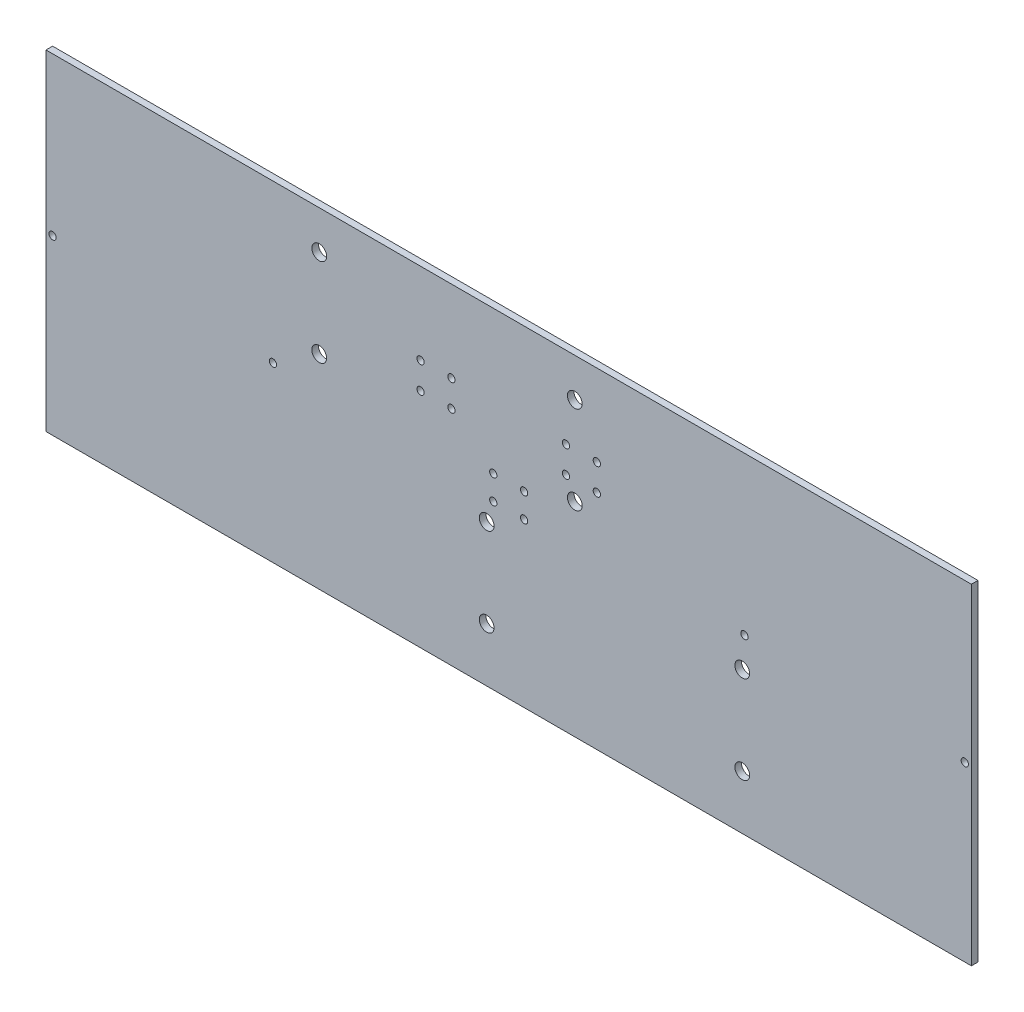
ISO-10303-21;
HEADER;
FILE_DESCRIPTION(('STEP AP214'),'2;1');
FILE_NAME('part.step','',(''),(''),'','','');
FILE_SCHEMA(('AUTOMOTIVE_DESIGN { 1 0 10303 214 1 1 1 1 }'));
ENDSEC;
DATA;
#1=APPLICATION_CONTEXT('core data for automotive mechanical design processes');
#2=APPLICATION_PROTOCOL_DEFINITION('international standard','automotive_design',2000,#1);
#3=PRODUCT_CONTEXT('',#1,'mechanical');
#4=PRODUCT('Part','Part','',(#3));
#5=PRODUCT_RELATED_PRODUCT_CATEGORY('part','',(#4));
#6=PRODUCT_DEFINITION_FORMATION('','',#4);
#7=PRODUCT_DEFINITION_CONTEXT('part definition',#1,'design');
#8=PRODUCT_DEFINITION('design','',#6,#7);
#9=PRODUCT_DEFINITION_SHAPE('','',#8);
#10=(LENGTH_UNIT() NAMED_UNIT(*) SI_UNIT(.MILLI.,.METRE.));
#11=(NAMED_UNIT(*) PLANE_ANGLE_UNIT() SI_UNIT($,.RADIAN.));
#12=(NAMED_UNIT(*) SI_UNIT($,.STERADIAN.) SOLID_ANGLE_UNIT());
#13=UNCERTAINTY_MEASURE_WITH_UNIT(LENGTH_MEASURE(1.E-05),#10,'distance_accuracy_value','');
#14=(GEOMETRIC_REPRESENTATION_CONTEXT(3) GLOBAL_UNCERTAINTY_ASSIGNED_CONTEXT((#13)) GLOBAL_UNIT_ASSIGNED_CONTEXT((#10,
#11,#12)) REPRESENTATION_CONTEXT('',''));
#15=CARTESIAN_POINT('',(0.,0.,0.));
#16=DIRECTION('',(0.,0.,1.));
#17=DIRECTION('',(1.,0.,0.));
#18=AXIS2_PLACEMENT_3D('',#15,#16,#17);
#19=CARTESIAN_POINT('',(0.,0.,3.));
#20=DIRECTION('',(1.,0.,0.));
#21=DIRECTION('',(0.,0.,-1.));
#22=AXIS2_PLACEMENT_3D('',#19,#20,#21);
#23=PLANE('',#22);
#24=DIRECTION('',(0.,0.,1.));
#25=VECTOR('',#24,1.);
#26=CARTESIAN_POINT('',(0.,150.,0.));
#27=LINE('',#26,#25);
#28=CARTESIAN_POINT('',(0.,150.,0.));
#29=VERTEX_POINT('',#28);
#30=CARTESIAN_POINT('',(0.,150.,3.));
#31=VERTEX_POINT('',#30);
#32=EDGE_CURVE('E96',#29,#31,#27,.T.);
#33=ORIENTED_EDGE('',*,*,#32,.F.);
#34=DIRECTION('',(0.,-1.,0.));
#35=VECTOR('',#34,1.);
#36=CARTESIAN_POINT('',(0.,0.,0.));
#37=LINE('',#36,#35);
#38=CARTESIAN_POINT('',(0.,0.,0.));
#39=VERTEX_POINT('',#38);
#40=EDGE_CURVE('E79',#29,#39,#37,.T.);
#41=ORIENTED_EDGE('',*,*,#40,.T.);
#42=DIRECTION('',(0.,0.,-1.));
#43=VECTOR('',#42,1.);
#44=CARTESIAN_POINT('',(0.,0.,3.));
#45=LINE('',#44,#43);
#46=CARTESIAN_POINT('',(0.,0.,3.));
#47=VERTEX_POINT('',#46);
#48=EDGE_CURVE('E11',#47,#39,#45,.T.);
#49=ORIENTED_EDGE('',*,*,#48,.F.);
#50=DIRECTION('',(0.,-1.,0.));
#51=VECTOR('',#50,1.);
#52=CARTESIAN_POINT('',(0.,0.,3.));
#53=LINE('',#52,#51);
#54=EDGE_CURVE('E87',#31,#47,#53,.T.);
#55=ORIENTED_EDGE('',*,*,#54,.F.);
#56=EDGE_LOOP('',(#33,#41,#49,#55));
#57=FACE_BOUND('',#56,.T.);
#58=ADVANCED_FACE('F35',(#57),#23,.F.);
#59=CARTESIAN_POINT('',(420.,0.,3.));
#60=DIRECTION('',(-1.,0.,0.));
#61=DIRECTION('',(0.,0.,1.));
#62=AXIS2_PLACEMENT_3D('',#59,#60,#61);
#63=PLANE('',#62);
#64=DIRECTION('',(0.,0.,-1.));
#65=VECTOR('',#64,1.);
#66=CARTESIAN_POINT('',(420.,150.,3.));
#67=LINE('',#66,#65);
#68=CARTESIAN_POINT('',(420.,150.,3.));
#69=VERTEX_POINT('',#68);
#70=CARTESIAN_POINT('',(420.,150.,0.));
#71=VERTEX_POINT('',#70);
#72=EDGE_CURVE('E49',#69,#71,#67,.T.);
#73=ORIENTED_EDGE('',*,*,#72,.F.);
#74=DIRECTION('',(0.,1.,0.));
#75=VECTOR('',#74,1.);
#76=CARTESIAN_POINT('',(420.,0.,3.));
#77=LINE('',#76,#75);
#78=CARTESIAN_POINT('',(420.,0.,3.));
#79=VERTEX_POINT('',#78);
#80=EDGE_CURVE('E84',#79,#69,#77,.T.);
#81=ORIENTED_EDGE('',*,*,#80,.F.);
#82=DIRECTION('',(0.,0.,-1.));
#83=VECTOR('',#82,1.);
#84=CARTESIAN_POINT('',(420.,0.,3.));
#85=LINE('',#84,#83);
#86=CARTESIAN_POINT('',(420.,0.,0.));
#87=VERTEX_POINT('',#86);
#88=EDGE_CURVE('E42',#79,#87,#85,.T.);
#89=ORIENTED_EDGE('',*,*,#88,.T.);
#90=DIRECTION('',(0.,1.,0.));
#91=VECTOR('',#90,1.);
#92=CARTESIAN_POINT('',(420.,0.,0.));
#93=LINE('',#92,#91);
#94=EDGE_CURVE('E78',#87,#71,#93,.T.);
#95=ORIENTED_EDGE('',*,*,#94,.T.);
#96=EDGE_LOOP('',(#73,#81,#89,#95));
#97=FACE_BOUND('',#96,.T.);
#98=ADVANCED_FACE('F83',(#97),#63,.F.);
#99=CARTESIAN_POINT('',(0.,0.,3.));
#100=DIRECTION('',(0.,0.,-1.));
#101=DIRECTION('',(-1.,0.,0.));
#102=AXIS2_PLACEMENT_3D('',#99,#100,#101);
#103=PLANE('',#102);
#104=CARTESIAN_POINT('',(417.,78.5000000000004,3.));
#105=DIRECTION('',(0.,0.,-1.));
#106=DIRECTION('',(-1.,0.,0.));
#107=AXIS2_PLACEMENT_3D('',#104,#105,#106);
#108=CIRCLE('',#107,1.64999999999999);
#109=CARTESIAN_POINT('',(415.35,78.5000000000004,3.));
#110=VERTEX_POINT('',#109);
#111=EDGE_CURVE('E101',#110,#110,#108,.T.);
#112=ORIENTED_EDGE('',*,*,#111,.T.);
#113=EDGE_LOOP('',(#112));
#114=FACE_BOUND('',#113,.T.);
#115=CARTESIAN_POINT('',(170.,113.,3.));
#116=DIRECTION('',(0.,0.,-1.));
#117=DIRECTION('',(-1.,0.,0.));
#118=AXIS2_PLACEMENT_3D('',#115,#116,#117);
#119=CIRCLE('',#118,1.64999999999999);
#120=CARTESIAN_POINT('',(168.35,113.,3.));
#121=VERTEX_POINT('',#120);
#122=EDGE_CURVE('E104',#121,#121,#119,.T.);
#123=ORIENTED_EDGE('',*,*,#122,.T.);
#124=EDGE_LOOP('',(#123));
#125=FACE_BOUND('',#124,.T.);
#126=CARTESIAN_POINT('',(170.,101.,3.));
#127=DIRECTION('',(0.,0.,-1.));
#128=DIRECTION('',(-1.,0.,0.));
#129=AXIS2_PLACEMENT_3D('',#126,#127,#128);
#130=CIRCLE('',#129,1.64999999999999);
#131=CARTESIAN_POINT('',(168.35,101.,3.));
#132=VERTEX_POINT('',#131);
#133=EDGE_CURVE('E107',#132,#132,#130,.T.);
#134=ORIENTED_EDGE('',*,*,#133,.T.);
#135=EDGE_LOOP('',(#134));
#136=FACE_BOUND('',#135,.T.);
#137=CARTESIAN_POINT('',(184.,101.,3.));
#138=DIRECTION('',(0.,0.,-1.));
#139=DIRECTION('',(-1.,0.,0.));
#140=AXIS2_PLACEMENT_3D('',#137,#138,#139);
#141=CIRCLE('',#140,1.64999999999999);
#142=CARTESIAN_POINT('',(182.35,101.,3.));
#143=VERTEX_POINT('',#142);
#144=EDGE_CURVE('E110',#143,#143,#141,.T.);
#145=ORIENTED_EDGE('',*,*,#144,.T.);
#146=EDGE_LOOP('',(#145));
#147=FACE_BOUND('',#146,.T.);
#148=CARTESIAN_POINT('',(316.,64.5,3.));
#149=DIRECTION('',(0.,0.,-1.));
#150=DIRECTION('',(-1.,0.,0.));
#151=AXIS2_PLACEMENT_3D('',#148,#149,#150);
#152=CIRCLE('',#151,3.35);
#153=CARTESIAN_POINT('',(312.65,64.5,3.));
#154=VERTEX_POINT('',#153);
#155=EDGE_CURVE('E113',#154,#154,#152,.T.);
#156=ORIENTED_EDGE('',*,*,#155,.T.);
#157=EDGE_LOOP('',(#156));
#158=FACE_BOUND('',#157,.T.);
#159=CARTESIAN_POINT('',(103.,78.5,3.));
#160=DIRECTION('',(0.,0.,-1.));
#161=DIRECTION('',(-1.,0.,0.));
#162=AXIS2_PLACEMENT_3D('',#159,#160,#161);
#163=CIRCLE('',#162,1.65);
#164=CARTESIAN_POINT('',(101.35,78.5,3.));
#165=VERTEX_POINT('',#164);
#166=EDGE_CURVE('E116',#165,#165,#163,.T.);
#167=ORIENTED_EDGE('',*,*,#166,.T.);
#168=EDGE_LOOP('',(#167));
#169=FACE_BOUND('',#168,.T.);
#170=CARTESIAN_POINT('',(2.99999999999998,78.5000000000003,3.));
#171=DIRECTION('',(0.,0.,-1.));
#172=DIRECTION('',(-1.,0.,0.));
#173=AXIS2_PLACEMENT_3D('',#170,#171,#172);
#174=CIRCLE('',#173,1.65);
#175=CARTESIAN_POINT('',(1.34999999999998,78.5000000000003,3.));
#176=VERTEX_POINT('',#175);
#177=EDGE_CURVE('E119',#176,#176,#174,.T.);
#178=ORIENTED_EDGE('',*,*,#177,.T.);
#179=EDGE_LOOP('',(#178));
#180=FACE_BOUND('',#179,.T.);
#181=CARTESIAN_POINT('',(317.,78.5,3.));
#182=DIRECTION('',(0.,0.,-1.));
#183=DIRECTION('',(-1.,0.,0.));
#184=AXIS2_PLACEMENT_3D('',#181,#182,#183);
#185=CIRCLE('',#184,1.64999999999999);
#186=CARTESIAN_POINT('',(315.35,78.5,3.));
#187=VERTEX_POINT('',#186);
#188=EDGE_CURVE('E122',#187,#187,#185,.T.);
#189=ORIENTED_EDGE('',*,*,#188,.T.);
#190=EDGE_LOOP('',(#189));
#191=FACE_BOUND('',#190,.T.);
#192=CARTESIAN_POINT('',(217.,85.,3.));
#193=DIRECTION('',(0.,0.,-1.));
#194=DIRECTION('',(-1.,0.,0.));
#195=AXIS2_PLACEMENT_3D('',#192,#193,#194);
#196=CIRCLE('',#195,1.65000000000002);
#197=CARTESIAN_POINT('',(215.35,85.,3.));
#198=VERTEX_POINT('',#197);
#199=EDGE_CURVE('E125',#198,#198,#196,.T.);
#200=ORIENTED_EDGE('',*,*,#199,.T.);
#201=EDGE_LOOP('',(#200));
#202=FACE_BOUND('',#201,.T.);
#203=CARTESIAN_POINT('',(236.,113.,3.));
#204=DIRECTION('',(0.,0.,-1.));
#205=DIRECTION('',(-1.,0.,0.));
#206=AXIS2_PLACEMENT_3D('',#203,#204,#205);
#207=CIRCLE('',#206,1.64999999999999);
#208=CARTESIAN_POINT('',(234.35,113.,3.));
#209=VERTEX_POINT('',#208);
#210=EDGE_CURVE('E128',#209,#209,#207,.T.);
#211=ORIENTED_EDGE('',*,*,#210,.T.);
#212=EDGE_LOOP('',(#211));
#213=FACE_BOUND('',#212,.T.);
#214=CARTESIAN_POINT('',(236.,101.,3.));
#215=DIRECTION('',(0.,0.,-1.));
#216=DIRECTION('',(-1.,0.,0.));
#217=AXIS2_PLACEMENT_3D('',#214,#215,#216);
#218=CIRCLE('',#217,1.64999999999999);
#219=CARTESIAN_POINT('',(234.35,101.,3.));
#220=VERTEX_POINT('',#219);
#221=EDGE_CURVE('E131',#220,#220,#218,.T.);
#222=ORIENTED_EDGE('',*,*,#221,.T.);
#223=EDGE_LOOP('',(#222));
#224=FACE_BOUND('',#223,.T.);
#225=CARTESIAN_POINT('',(250.,113.,3.));
#226=DIRECTION('',(0.,0.,-1.));
#227=DIRECTION('',(-1.,0.,0.));
#228=AXIS2_PLACEMENT_3D('',#225,#226,#227);
#229=CIRCLE('',#228,1.64999999999999);
#230=CARTESIAN_POINT('',(248.35,113.,3.));
#231=VERTEX_POINT('',#230);
#232=EDGE_CURVE('E134',#231,#231,#229,.T.);
#233=ORIENTED_EDGE('',*,*,#232,.T.);
#234=EDGE_LOOP('',(#233));
#235=FACE_BOUND('',#234,.T.);
#236=CARTESIAN_POINT('',(184.,113.,3.));
#237=DIRECTION('',(0.,0.,-1.));
#238=DIRECTION('',(-1.,0.,0.));
#239=AXIS2_PLACEMENT_3D('',#236,#237,#238);
#240=CIRCLE('',#239,1.64999999999999);
#241=CARTESIAN_POINT('',(182.35,113.,3.));
#242=VERTEX_POINT('',#241);
#243=EDGE_CURVE('E137',#242,#242,#240,.T.);
#244=ORIENTED_EDGE('',*,*,#243,.T.);
#245=EDGE_LOOP('',(#244));
#246=FACE_BOUND('',#245,.T.);
#247=CARTESIAN_POINT('',(203.,74.,3.));
#248=DIRECTION('',(0.,0.,-1.));
#249=DIRECTION('',(-1.,0.,0.));
#250=AXIS2_PLACEMENT_3D('',#247,#248,#249);
#251=CIRCLE('',#250,1.64999999999999);
#252=CARTESIAN_POINT('',(201.35,74.,3.));
#253=VERTEX_POINT('',#252);
#254=EDGE_CURVE('E140',#253,#253,#251,.T.);
#255=ORIENTED_EDGE('',*,*,#254,.T.);
#256=EDGE_LOOP('',(#255));
#257=FACE_BOUND('',#256,.T.);
#258=CARTESIAN_POINT('',(203.,85.,3.));
#259=DIRECTION('',(0.,0.,-1.));
#260=DIRECTION('',(-1.,0.,0.));
#261=AXIS2_PLACEMENT_3D('',#258,#259,#260);
#262=CIRCLE('',#261,1.64999999999999);
#263=CARTESIAN_POINT('',(201.35,85.,3.));
#264=VERTEX_POINT('',#263);
#265=EDGE_CURVE('E143',#264,#264,#262,.T.);
#266=ORIENTED_EDGE('',*,*,#265,.T.);
#267=EDGE_LOOP('',(#266));
#268=FACE_BOUND('',#267,.T.);
#269=CARTESIAN_POINT('',(217.,74.,3.));
#270=DIRECTION('',(0.,0.,-1.));
#271=DIRECTION('',(-1.,0.,0.));
#272=AXIS2_PLACEMENT_3D('',#269,#270,#271);
#273=CIRCLE('',#272,1.65000000000002);
#274=CARTESIAN_POINT('',(215.35,74.,3.));
#275=VERTEX_POINT('',#274);
#276=EDGE_CURVE('E146',#275,#275,#273,.T.);
#277=ORIENTED_EDGE('',*,*,#276,.T.);
#278=EDGE_LOOP('',(#277));
#279=FACE_BOUND('',#278,.T.);
#280=CARTESIAN_POINT('',(240.,92.5,3.));
#281=DIRECTION('',(0.,0.,-1.));
#282=DIRECTION('',(-1.,0.,0.));
#283=AXIS2_PLACEMENT_3D('',#280,#281,#282);
#284=CIRCLE('',#283,3.35);
#285=CARTESIAN_POINT('',(236.65,92.5,3.));
#286=VERTEX_POINT('',#285);
#287=EDGE_CURVE('E149',#286,#286,#284,.T.);
#288=ORIENTED_EDGE('',*,*,#287,.T.);
#289=EDGE_LOOP('',(#288));
#290=FACE_BOUND('',#289,.T.);
#291=CARTESIAN_POINT('',(124.,132.5,3.));
#292=DIRECTION('',(0.,0.,-1.));
#293=DIRECTION('',(-1.,0.,0.));
#294=AXIS2_PLACEMENT_3D('',#291,#292,#293);
#295=CIRCLE('',#294,3.35);
#296=CARTESIAN_POINT('',(120.65,132.5,3.));
#297=VERTEX_POINT('',#296);
#298=EDGE_CURVE('E152',#297,#297,#295,.T.);
#299=ORIENTED_EDGE('',*,*,#298,.T.);
#300=EDGE_LOOP('',(#299));
#301=FACE_BOUND('',#300,.T.);
#302=CARTESIAN_POINT('',(124.,92.5,3.));
#303=DIRECTION('',(0.,0.,-1.));
#304=DIRECTION('',(-1.,0.,0.));
#305=AXIS2_PLACEMENT_3D('',#302,#303,#304);
#306=CIRCLE('',#305,3.35);
#307=CARTESIAN_POINT('',(120.65,92.5,3.));
#308=VERTEX_POINT('',#307);
#309=EDGE_CURVE('E155',#308,#308,#306,.T.);
#310=ORIENTED_EDGE('',*,*,#309,.T.);
#311=EDGE_LOOP('',(#310));
#312=FACE_BOUND('',#311,.T.);
#313=CARTESIAN_POINT('',(240.,132.5,3.));
#314=DIRECTION('',(0.,0.,-1.));
#315=DIRECTION('',(-1.,0.,0.));
#316=AXIS2_PLACEMENT_3D('',#313,#314,#315);
#317=CIRCLE('',#316,3.35);
#318=CARTESIAN_POINT('',(236.65,132.5,3.));
#319=VERTEX_POINT('',#318);
#320=EDGE_CURVE('E158',#319,#319,#317,.T.);
#321=ORIENTED_EDGE('',*,*,#320,.T.);
#322=EDGE_LOOP('',(#321));
#323=FACE_BOUND('',#322,.T.);
#324=CARTESIAN_POINT('',(200.,64.5,3.));
#325=DIRECTION('',(0.,0.,-1.));
#326=DIRECTION('',(-1.,0.,0.));
#327=AXIS2_PLACEMENT_3D('',#324,#325,#326);
#328=CIRCLE('',#327,3.35);
#329=CARTESIAN_POINT('',(196.65,64.5,3.));
#330=VERTEX_POINT('',#329);
#331=EDGE_CURVE('E161',#330,#330,#328,.T.);
#332=ORIENTED_EDGE('',*,*,#331,.T.);
#333=EDGE_LOOP('',(#332));
#334=FACE_BOUND('',#333,.T.);
#335=CARTESIAN_POINT('',(200.,24.5,3.));
#336=DIRECTION('',(0.,0.,-1.));
#337=DIRECTION('',(-1.,0.,0.));
#338=AXIS2_PLACEMENT_3D('',#335,#336,#337);
#339=CIRCLE('',#338,3.35);
#340=CARTESIAN_POINT('',(196.65,24.5,3.));
#341=VERTEX_POINT('',#340);
#342=EDGE_CURVE('E164',#341,#341,#339,.T.);
#343=ORIENTED_EDGE('',*,*,#342,.T.);
#344=EDGE_LOOP('',(#343));
#345=FACE_BOUND('',#344,.T.);
#346=CARTESIAN_POINT('',(316.,24.5,3.));
#347=DIRECTION('',(0.,0.,-1.));
#348=DIRECTION('',(-1.,0.,0.));
#349=AXIS2_PLACEMENT_3D('',#346,#347,#348);
#350=CIRCLE('',#349,3.35);
#351=CARTESIAN_POINT('',(312.65,24.5,3.));
#352=VERTEX_POINT('',#351);
#353=EDGE_CURVE('E167',#352,#352,#350,.T.);
#354=ORIENTED_EDGE('',*,*,#353,.T.);
#355=EDGE_LOOP('',(#354));
#356=FACE_BOUND('',#355,.T.);
#357=CARTESIAN_POINT('',(250.,101.,3.));
#358=DIRECTION('',(0.,0.,-1.));
#359=DIRECTION('',(-1.,0.,0.));
#360=AXIS2_PLACEMENT_3D('',#357,#358,#359);
#361=CIRCLE('',#360,1.64999999999999);
#362=CARTESIAN_POINT('',(248.35,101.,3.));
#363=VERTEX_POINT('',#362);
#364=EDGE_CURVE('E170',#363,#363,#361,.T.);
#365=ORIENTED_EDGE('',*,*,#364,.T.);
#366=EDGE_LOOP('',(#365));
#367=FACE_BOUND('',#366,.T.);
#368=DIRECTION('',(1.,0.,0.));
#369=VECTOR('',#368,1.);
#370=CARTESIAN_POINT('',(0.,150.,3.));
#371=LINE('',#370,#369);
#372=EDGE_CURVE('E92',#31,#69,#371,.T.);
#373=ORIENTED_EDGE('',*,*,#372,.F.);
#374=ORIENTED_EDGE('',*,*,#54,.T.);
#375=DIRECTION('',(1.,0.,0.));
#376=VECTOR('',#375,1.);
#377=CARTESIAN_POINT('',(0.,0.,3.));
#378=LINE('',#377,#376);
#379=EDGE_CURVE('E58',#47,#79,#378,.T.);
#380=ORIENTED_EDGE('',*,*,#379,.T.);
#381=ORIENTED_EDGE('',*,*,#80,.T.);
#382=EDGE_LOOP('',(#373,#374,#380,#381));
#383=FACE_BOUND('',#382,.T.);
#384=ADVANCED_FACE('F251',(#114,#125,#136,#147,#158,#169,#180,#191,#202,#213,#224,#235,#246,
#257,#268,#279,#290,#301,#312,#323,#334,#345,#356,#367,#383),#103,.F.);
#385=CARTESIAN_POINT('',(0.,0.,0.));
#386=DIRECTION('',(0.,0.,-1.));
#387=DIRECTION('',(-1.,0.,0.));
#388=AXIS2_PLACEMENT_3D('',#385,#386,#387);
#389=PLANE('',#388);
#390=CARTESIAN_POINT('',(417.,78.5000000000004,0.));
#391=DIRECTION('',(0.,0.,-1.));
#392=DIRECTION('',(-1.,0.,0.));
#393=AXIS2_PLACEMENT_3D('',#390,#391,#392);
#394=CIRCLE('',#393,1.64999999999999);
#395=CARTESIAN_POINT('',(415.35,78.5000000000004,0.));
#396=VERTEX_POINT('',#395);
#397=EDGE_CURVE('E207',#396,#396,#394,.T.);
#398=ORIENTED_EDGE('',*,*,#397,.F.);
#399=EDGE_LOOP('',(#398));
#400=FACE_BOUND('',#399,.T.);
#401=CARTESIAN_POINT('',(170.,113.,0.));
#402=DIRECTION('',(0.,0.,-1.));
#403=DIRECTION('',(-1.,0.,0.));
#404=AXIS2_PLACEMENT_3D('',#401,#402,#403);
#405=CIRCLE('',#404,1.64999999999999);
#406=CARTESIAN_POINT('',(168.35,113.,0.));
#407=VERTEX_POINT('',#406);
#408=EDGE_CURVE('E204',#407,#407,#405,.T.);
#409=ORIENTED_EDGE('',*,*,#408,.F.);
#410=EDGE_LOOP('',(#409));
#411=FACE_BOUND('',#410,.T.);
#412=CARTESIAN_POINT('',(170.,101.,0.));
#413=DIRECTION('',(0.,0.,-1.));
#414=DIRECTION('',(-1.,0.,0.));
#415=AXIS2_PLACEMENT_3D('',#412,#413,#414);
#416=CIRCLE('',#415,1.64999999999999);
#417=CARTESIAN_POINT('',(168.35,101.,0.));
#418=VERTEX_POINT('',#417);
#419=EDGE_CURVE('E201',#418,#418,#416,.T.);
#420=ORIENTED_EDGE('',*,*,#419,.F.);
#421=EDGE_LOOP('',(#420));
#422=FACE_BOUND('',#421,.T.);
#423=CARTESIAN_POINT('',(184.,101.,0.));
#424=DIRECTION('',(0.,0.,-1.));
#425=DIRECTION('',(-1.,0.,0.));
#426=AXIS2_PLACEMENT_3D('',#423,#424,#425);
#427=CIRCLE('',#426,1.64999999999999);
#428=CARTESIAN_POINT('',(182.35,101.,0.));
#429=VERTEX_POINT('',#428);
#430=EDGE_CURVE('E198',#429,#429,#427,.T.);
#431=ORIENTED_EDGE('',*,*,#430,.F.);
#432=EDGE_LOOP('',(#431));
#433=FACE_BOUND('',#432,.T.);
#434=CARTESIAN_POINT('',(316.,64.5,0.));
#435=DIRECTION('',(0.,0.,-1.));
#436=DIRECTION('',(-1.,0.,0.));
#437=AXIS2_PLACEMENT_3D('',#434,#435,#436);
#438=CIRCLE('',#437,3.35);
#439=CARTESIAN_POINT('',(312.65,64.5,0.));
#440=VERTEX_POINT('',#439);
#441=EDGE_CURVE('E219',#440,#440,#438,.T.);
#442=ORIENTED_EDGE('',*,*,#441,.F.);
#443=EDGE_LOOP('',(#442));
#444=FACE_BOUND('',#443,.T.);
#445=CARTESIAN_POINT('',(103.,78.5,0.));
#446=DIRECTION('',(0.,0.,-1.));
#447=DIRECTION('',(-1.,0.,0.));
#448=AXIS2_PLACEMENT_3D('',#445,#446,#447);
#449=CIRCLE('',#448,1.65);
#450=CARTESIAN_POINT('',(101.35,78.5,0.));
#451=VERTEX_POINT('',#450);
#452=EDGE_CURVE('E216',#451,#451,#449,.T.);
#453=ORIENTED_EDGE('',*,*,#452,.F.);
#454=EDGE_LOOP('',(#453));
#455=FACE_BOUND('',#454,.T.);
#456=CARTESIAN_POINT('',(2.99999999999998,78.5000000000003,0.));
#457=DIRECTION('',(0.,0.,-1.));
#458=DIRECTION('',(-1.,0.,0.));
#459=AXIS2_PLACEMENT_3D('',#456,#457,#458);
#460=CIRCLE('',#459,1.65);
#461=CARTESIAN_POINT('',(1.34999999999998,78.5000000000003,0.));
#462=VERTEX_POINT('',#461);
#463=EDGE_CURVE('E213',#462,#462,#460,.T.);
#464=ORIENTED_EDGE('',*,*,#463,.F.);
#465=EDGE_LOOP('',(#464));
#466=FACE_BOUND('',#465,.T.);
#467=CARTESIAN_POINT('',(317.,78.5,0.));
#468=DIRECTION('',(0.,0.,-1.));
#469=DIRECTION('',(-1.,0.,0.));
#470=AXIS2_PLACEMENT_3D('',#467,#468,#469);
#471=CIRCLE('',#470,1.64999999999999);
#472=CARTESIAN_POINT('',(315.35,78.5,0.));
#473=VERTEX_POINT('',#472);
#474=EDGE_CURVE('E210',#473,#473,#471,.T.);
#475=ORIENTED_EDGE('',*,*,#474,.F.);
#476=EDGE_LOOP('',(#475));
#477=FACE_BOUND('',#476,.T.);
#478=CARTESIAN_POINT('',(217.,85.,0.));
#479=DIRECTION('',(0.,0.,-1.));
#480=DIRECTION('',(-1.,0.,0.));
#481=AXIS2_PLACEMENT_3D('',#478,#479,#480);
#482=CIRCLE('',#481,1.65000000000002);
#483=CARTESIAN_POINT('',(215.35,85.,0.));
#484=VERTEX_POINT('',#483);
#485=EDGE_CURVE('E183',#484,#484,#482,.T.);
#486=ORIENTED_EDGE('',*,*,#485,.F.);
#487=EDGE_LOOP('',(#486));
#488=FACE_BOUND('',#487,.T.);
#489=CARTESIAN_POINT('',(236.,113.,0.));
#490=DIRECTION('',(0.,0.,-1.));
#491=DIRECTION('',(-1.,0.,0.));
#492=AXIS2_PLACEMENT_3D('',#489,#490,#491);
#493=CIRCLE('',#492,1.64999999999999);
#494=CARTESIAN_POINT('',(234.35,113.,0.));
#495=VERTEX_POINT('',#494);
#496=EDGE_CURVE('E180',#495,#495,#493,.T.);
#497=ORIENTED_EDGE('',*,*,#496,.F.);
#498=EDGE_LOOP('',(#497));
#499=FACE_BOUND('',#498,.T.);
#500=CARTESIAN_POINT('',(236.,101.,0.));
#501=DIRECTION('',(0.,0.,-1.));
#502=DIRECTION('',(-1.,0.,0.));
#503=AXIS2_PLACEMENT_3D('',#500,#501,#502);
#504=CIRCLE('',#503,1.64999999999999);
#505=CARTESIAN_POINT('',(234.35,101.,0.));
#506=VERTEX_POINT('',#505);
#507=EDGE_CURVE('E177',#506,#506,#504,.T.);
#508=ORIENTED_EDGE('',*,*,#507,.F.);
#509=EDGE_LOOP('',(#508));
#510=FACE_BOUND('',#509,.T.);
#511=CARTESIAN_POINT('',(250.,113.,0.));
#512=DIRECTION('',(0.,0.,-1.));
#513=DIRECTION('',(-1.,0.,0.));
#514=AXIS2_PLACEMENT_3D('',#511,#512,#513);
#515=CIRCLE('',#514,1.64999999999999);
#516=CARTESIAN_POINT('',(248.35,113.,0.));
#517=VERTEX_POINT('',#516);
#518=EDGE_CURVE('E176',#517,#517,#515,.T.);
#519=ORIENTED_EDGE('',*,*,#518,.F.);
#520=EDGE_LOOP('',(#519));
#521=FACE_BOUND('',#520,.T.);
#522=CARTESIAN_POINT('',(184.,113.,0.));
#523=DIRECTION('',(0.,0.,-1.));
#524=DIRECTION('',(-1.,0.,0.));
#525=AXIS2_PLACEMENT_3D('',#522,#523,#524);
#526=CIRCLE('',#525,1.64999999999999);
#527=CARTESIAN_POINT('',(182.35,113.,0.));
#528=VERTEX_POINT('',#527);
#529=EDGE_CURVE('E195',#528,#528,#526,.T.);
#530=ORIENTED_EDGE('',*,*,#529,.F.);
#531=EDGE_LOOP('',(#530));
#532=FACE_BOUND('',#531,.T.);
#533=CARTESIAN_POINT('',(203.,74.,0.));
#534=DIRECTION('',(0.,0.,-1.));
#535=DIRECTION('',(-1.,0.,0.));
#536=AXIS2_PLACEMENT_3D('',#533,#534,#535);
#537=CIRCLE('',#536,1.64999999999999);
#538=CARTESIAN_POINT('',(201.35,74.,0.));
#539=VERTEX_POINT('',#538);
#540=EDGE_CURVE('E192',#539,#539,#537,.T.);
#541=ORIENTED_EDGE('',*,*,#540,.F.);
#542=EDGE_LOOP('',(#541));
#543=FACE_BOUND('',#542,.T.);
#544=CARTESIAN_POINT('',(203.,85.,0.));
#545=DIRECTION('',(0.,0.,-1.));
#546=DIRECTION('',(-1.,0.,0.));
#547=AXIS2_PLACEMENT_3D('',#544,#545,#546);
#548=CIRCLE('',#547,1.64999999999999);
#549=CARTESIAN_POINT('',(201.35,85.,0.));
#550=VERTEX_POINT('',#549);
#551=EDGE_CURVE('E189',#550,#550,#548,.T.);
#552=ORIENTED_EDGE('',*,*,#551,.F.);
#553=EDGE_LOOP('',(#552));
#554=FACE_BOUND('',#553,.T.);
#555=CARTESIAN_POINT('',(217.,74.,0.));
#556=DIRECTION('',(0.,0.,-1.));
#557=DIRECTION('',(-1.,0.,0.));
#558=AXIS2_PLACEMENT_3D('',#555,#556,#557);
#559=CIRCLE('',#558,1.65000000000002);
#560=CARTESIAN_POINT('',(215.35,74.,0.));
#561=VERTEX_POINT('',#560);
#562=EDGE_CURVE('E186',#561,#561,#559,.T.);
#563=ORIENTED_EDGE('',*,*,#562,.F.);
#564=EDGE_LOOP('',(#563));
#565=FACE_BOUND('',#564,.T.);
#566=CARTESIAN_POINT('',(240.,92.5,0.));
#567=DIRECTION('',(0.,0.,-1.));
#568=DIRECTION('',(-1.,0.,0.));
#569=AXIS2_PLACEMENT_3D('',#566,#567,#568);
#570=CIRCLE('',#569,3.35);
#571=CARTESIAN_POINT('',(236.65,92.5,0.));
#572=VERTEX_POINT('',#571);
#573=EDGE_CURVE('E229',#572,#572,#570,.T.);
#574=ORIENTED_EDGE('',*,*,#573,.F.);
#575=EDGE_LOOP('',(#574));
#576=FACE_BOUND('',#575,.T.);
#577=CARTESIAN_POINT('',(124.,132.5,0.));
#578=DIRECTION('',(0.,0.,-1.));
#579=DIRECTION('',(-1.,0.,0.));
#580=AXIS2_PLACEMENT_3D('',#577,#578,#579);
#581=CIRCLE('',#580,3.35);
#582=CARTESIAN_POINT('',(120.65,132.5,0.));
#583=VERTEX_POINT('',#582);
#584=EDGE_CURVE('E237',#583,#583,#581,.T.);
#585=ORIENTED_EDGE('',*,*,#584,.F.);
#586=EDGE_LOOP('',(#585));
#587=FACE_BOUND('',#586,.T.);
#588=CARTESIAN_POINT('',(124.,92.5,0.));
#589=DIRECTION('',(0.,0.,-1.));
#590=DIRECTION('',(-1.,0.,0.));
#591=AXIS2_PLACEMENT_3D('',#588,#589,#590);
#592=CIRCLE('',#591,3.35);
#593=CARTESIAN_POINT('',(120.65,92.5,0.));
#594=VERTEX_POINT('',#593);
#595=EDGE_CURVE('E240',#594,#594,#592,.T.);
#596=ORIENTED_EDGE('',*,*,#595,.F.);
#597=EDGE_LOOP('',(#596));
#598=FACE_BOUND('',#597,.T.);
#599=CARTESIAN_POINT('',(240.,132.5,0.));
#600=DIRECTION('',(0.,0.,-1.));
#601=DIRECTION('',(-1.,0.,0.));
#602=AXIS2_PLACEMENT_3D('',#599,#600,#601);
#603=CIRCLE('',#602,3.35);
#604=CARTESIAN_POINT('',(236.65,132.5,0.));
#605=VERTEX_POINT('',#604);
#606=EDGE_CURVE('E225',#605,#605,#603,.T.);
#607=ORIENTED_EDGE('',*,*,#606,.F.);
#608=EDGE_LOOP('',(#607));
#609=FACE_BOUND('',#608,.T.);
#610=CARTESIAN_POINT('',(200.,64.5,0.));
#611=DIRECTION('',(0.,0.,-1.));
#612=DIRECTION('',(-1.,0.,0.));
#613=AXIS2_PLACEMENT_3D('',#610,#611,#612);
#614=CIRCLE('',#613,3.35);
#615=CARTESIAN_POINT('',(196.65,64.5,0.));
#616=VERTEX_POINT('',#615);
#617=EDGE_CURVE('E228',#616,#616,#614,.T.);
#618=ORIENTED_EDGE('',*,*,#617,.F.);
#619=EDGE_LOOP('',(#618));
#620=FACE_BOUND('',#619,.T.);
#621=CARTESIAN_POINT('',(200.,24.5,0.));
#622=DIRECTION('',(0.,0.,-1.));
#623=DIRECTION('',(-1.,0.,0.));
#624=AXIS2_PLACEMENT_3D('',#621,#622,#623);
#625=CIRCLE('',#624,3.35);
#626=CARTESIAN_POINT('',(196.65,24.5,0.));
#627=VERTEX_POINT('',#626);
#628=EDGE_CURVE('E232',#627,#627,#625,.T.);
#629=ORIENTED_EDGE('',*,*,#628,.F.);
#630=EDGE_LOOP('',(#629));
#631=FACE_BOUND('',#630,.T.);
#632=CARTESIAN_POINT('',(316.,24.5,0.));
#633=DIRECTION('',(0.,0.,-1.));
#634=DIRECTION('',(-1.,0.,0.));
#635=AXIS2_PLACEMENT_3D('',#632,#633,#634);
#636=CIRCLE('',#635,3.35);
#637=CARTESIAN_POINT('',(312.65,24.5,0.));
#638=VERTEX_POINT('',#637);
#639=EDGE_CURVE('E222',#638,#638,#636,.T.);
#640=ORIENTED_EDGE('',*,*,#639,.F.);
#641=EDGE_LOOP('',(#640));
#642=FACE_BOUND('',#641,.T.);
#643=CARTESIAN_POINT('',(250.,101.,0.));
#644=DIRECTION('',(0.,0.,-1.));
#645=DIRECTION('',(-1.,0.,0.));
#646=AXIS2_PLACEMENT_3D('',#643,#644,#645);
#647=CIRCLE('',#646,1.64999999999999);
#648=CARTESIAN_POINT('',(248.35,101.,0.));
#649=VERTEX_POINT('',#648);
#650=EDGE_CURVE('E173',#649,#649,#647,.T.);
#651=ORIENTED_EDGE('',*,*,#650,.F.);
#652=EDGE_LOOP('',(#651));
#653=FACE_BOUND('',#652,.T.);
#654=ORIENTED_EDGE('',*,*,#40,.F.);
#655=DIRECTION('',(-1.,0.,0.));
#656=VECTOR('',#655,1.);
#657=CARTESIAN_POINT('',(420.,150.,0.));
#658=LINE('',#657,#656);
#659=EDGE_CURVE('E86',#71,#29,#658,.T.);
#660=ORIENTED_EDGE('',*,*,#659,.F.);
#661=ORIENTED_EDGE('',*,*,#94,.F.);
#662=DIRECTION('',(1.,0.,0.));
#663=VECTOR('',#662,1.);
#664=CARTESIAN_POINT('',(0.,0.,0.));
#665=LINE('',#664,#663);
#666=EDGE_CURVE('E70',#39,#87,#665,.T.);
#667=ORIENTED_EDGE('',*,*,#666,.F.);
#668=EDGE_LOOP('',(#654,#660,#661,#667));
#669=FACE_BOUND('',#668,.T.);
#670=ADVANCED_FACE('F85',(#400,#411,#422,#433,#444,#455,#466,#477,#488,#499,#510,#521,#532,#543,
#554,#565,#576,#587,#598,#609,#620,#631,#642,#653,#669),#389,.T.);
#671=CARTESIAN_POINT('',(0.,0.,3.));
#672=DIRECTION('',(0.,1.,0.));
#673=DIRECTION('',(0.,0.,1.));
#674=AXIS2_PLACEMENT_3D('',#671,#672,#673);
#675=PLANE('',#674);
#676=ORIENTED_EDGE('',*,*,#666,.T.);
#677=ORIENTED_EDGE('',*,*,#88,.F.);
#678=ORIENTED_EDGE('',*,*,#379,.F.);
#679=ORIENTED_EDGE('',*,*,#48,.T.);
#680=EDGE_LOOP('',(#676,#677,#678,#679));
#681=FACE_BOUND('',#680,.T.);
#682=ADVANCED_FACE('F72',(#681),#675,.F.);
#683=CARTESIAN_POINT('',(0.,150.,0.));
#684=DIRECTION('',(0.,1.,0.));
#685=DIRECTION('',(0.,0.,1.));
#686=AXIS2_PLACEMENT_3D('',#683,#684,#685);
#687=PLANE('',#686);
#688=ORIENTED_EDGE('',*,*,#72,.T.);
#689=ORIENTED_EDGE('',*,*,#659,.T.);
#690=ORIENTED_EDGE('',*,*,#32,.T.);
#691=ORIENTED_EDGE('',*,*,#372,.T.);
#692=EDGE_LOOP('',(#688,#689,#690,#691));
#693=FACE_BOUND('',#692,.T.);
#694=ADVANCED_FACE('F268',(#693),#687,.T.);
#695=CARTESIAN_POINT('',(250.,101.,40.));
#696=DIRECTION('',(0.,0.,-1.));
#697=DIRECTION('',(-1.,0.,0.));
#698=AXIS2_PLACEMENT_3D('',#695,#696,#697);
#699=CYLINDRICAL_SURFACE('',#698,1.64999999999999);
#700=ORIENTED_EDGE('',*,*,#650,.T.);
#701=EDGE_LOOP('',(#700));
#702=FACE_BOUND('',#701,.T.);
#703=ORIENTED_EDGE('',*,*,#364,.F.);
#704=EDGE_LOOP('',(#703));
#705=FACE_BOUND('',#704,.T.);
#706=ADVANCED_FACE('F264',(#702,#705),#699,.F.);
#707=CARTESIAN_POINT('',(316.,24.5,40.));
#708=DIRECTION('',(0.,0.,-1.));
#709=DIRECTION('',(-1.,0.,0.));
#710=AXIS2_PLACEMENT_3D('',#707,#708,#709);
#711=CYLINDRICAL_SURFACE('',#710,3.35);
#712=ORIENTED_EDGE('',*,*,#639,.T.);
#713=EDGE_LOOP('',(#712));
#714=FACE_BOUND('',#713,.T.);
#715=ORIENTED_EDGE('',*,*,#353,.F.);
#716=EDGE_LOOP('',(#715));
#717=FACE_BOUND('',#716,.T.);
#718=ADVANCED_FACE('F267',(#714,#717),#711,.F.);
#719=CARTESIAN_POINT('',(200.,24.5,40.));
#720=DIRECTION('',(0.,0.,-1.));
#721=DIRECTION('',(-1.,0.,0.));
#722=AXIS2_PLACEMENT_3D('',#719,#720,#721);
#723=CYLINDRICAL_SURFACE('',#722,3.35);
#724=ORIENTED_EDGE('',*,*,#628,.T.);
#725=EDGE_LOOP('',(#724));
#726=FACE_BOUND('',#725,.T.);
#727=ORIENTED_EDGE('',*,*,#342,.F.);
#728=EDGE_LOOP('',(#727));
#729=FACE_BOUND('',#728,.T.);
#730=ADVANCED_FACE('F336',(#726,#729),#723,.F.);
#731=CARTESIAN_POINT('',(200.,64.5,40.));
#732=DIRECTION('',(0.,0.,-1.));
#733=DIRECTION('',(-1.,0.,0.));
#734=AXIS2_PLACEMENT_3D('',#731,#732,#733);
#735=CYLINDRICAL_SURFACE('',#734,3.35);
#736=ORIENTED_EDGE('',*,*,#617,.T.);
#737=EDGE_LOOP('',(#736));
#738=FACE_BOUND('',#737,.T.);
#739=ORIENTED_EDGE('',*,*,#331,.F.);
#740=EDGE_LOOP('',(#739));
#741=FACE_BOUND('',#740,.T.);
#742=ADVANCED_FACE('F345',(#738,#741),#735,.F.);
#743=CARTESIAN_POINT('',(240.,132.5,40.));
#744=DIRECTION('',(0.,0.,-1.));
#745=DIRECTION('',(-1.,0.,0.));
#746=AXIS2_PLACEMENT_3D('',#743,#744,#745);
#747=CYLINDRICAL_SURFACE('',#746,3.35);
#748=ORIENTED_EDGE('',*,*,#606,.T.);
#749=EDGE_LOOP('',(#748));
#750=FACE_BOUND('',#749,.T.);
#751=ORIENTED_EDGE('',*,*,#320,.F.);
#752=EDGE_LOOP('',(#751));
#753=FACE_BOUND('',#752,.T.);
#754=ADVANCED_FACE('F354',(#750,#753),#747,.F.);
#755=CARTESIAN_POINT('',(124.,92.5,40.));
#756=DIRECTION('',(0.,0.,-1.));
#757=DIRECTION('',(-1.,0.,0.));
#758=AXIS2_PLACEMENT_3D('',#755,#756,#757);
#759=CYLINDRICAL_SURFACE('',#758,3.35);
#760=ORIENTED_EDGE('',*,*,#595,.T.);
#761=EDGE_LOOP('',(#760));
#762=FACE_BOUND('',#761,.T.);
#763=ORIENTED_EDGE('',*,*,#309,.F.);
#764=EDGE_LOOP('',(#763));
#765=FACE_BOUND('',#764,.T.);
#766=ADVANCED_FACE('F246',(#762,#765),#759,.F.);
#767=CARTESIAN_POINT('',(124.,132.5,40.));
#768=DIRECTION('',(0.,0.,-1.));
#769=DIRECTION('',(-1.,0.,0.));
#770=AXIS2_PLACEMENT_3D('',#767,#768,#769);
#771=CYLINDRICAL_SURFACE('',#770,3.35);
#772=ORIENTED_EDGE('',*,*,#584,.T.);
#773=EDGE_LOOP('',(#772));
#774=FACE_BOUND('',#773,.T.);
#775=ORIENTED_EDGE('',*,*,#298,.F.);
#776=EDGE_LOOP('',(#775));
#777=FACE_BOUND('',#776,.T.);
#778=ADVANCED_FACE('F371',(#774,#777),#771,.F.);
#779=CARTESIAN_POINT('',(240.,92.5,40.));
#780=DIRECTION('',(0.,0.,-1.));
#781=DIRECTION('',(-1.,0.,0.));
#782=AXIS2_PLACEMENT_3D('',#779,#780,#781);
#783=CYLINDRICAL_SURFACE('',#782,3.35);
#784=ORIENTED_EDGE('',*,*,#573,.T.);
#785=EDGE_LOOP('',(#784));
#786=FACE_BOUND('',#785,.T.);
#787=ORIENTED_EDGE('',*,*,#287,.F.);
#788=EDGE_LOOP('',(#787));
#789=FACE_BOUND('',#788,.T.);
#790=ADVANCED_FACE('F379',(#786,#789),#783,.F.);
#791=CARTESIAN_POINT('',(217.,74.,40.));
#792=DIRECTION('',(0.,0.,-1.));
#793=DIRECTION('',(-1.,0.,0.));
#794=AXIS2_PLACEMENT_3D('',#791,#792,#793);
#795=CYLINDRICAL_SURFACE('',#794,1.65000000000002);
#796=ORIENTED_EDGE('',*,*,#562,.T.);
#797=EDGE_LOOP('',(#796));
#798=FACE_BOUND('',#797,.T.);
#799=ORIENTED_EDGE('',*,*,#276,.F.);
#800=EDGE_LOOP('',(#799));
#801=FACE_BOUND('',#800,.T.);
#802=ADVANCED_FACE('F388',(#798,#801),#795,.F.);
#803=CARTESIAN_POINT('',(203.,85.,40.));
#804=DIRECTION('',(0.,0.,-1.));
#805=DIRECTION('',(-1.,0.,0.));
#806=AXIS2_PLACEMENT_3D('',#803,#804,#805);
#807=CYLINDRICAL_SURFACE('',#806,1.64999999999999);
#808=ORIENTED_EDGE('',*,*,#551,.T.);
#809=EDGE_LOOP('',(#808));
#810=FACE_BOUND('',#809,.T.);
#811=ORIENTED_EDGE('',*,*,#265,.F.);
#812=EDGE_LOOP('',(#811));
#813=FACE_BOUND('',#812,.T.);
#814=ADVANCED_FACE('F397',(#810,#813),#807,.F.);
#815=CARTESIAN_POINT('',(203.,74.,40.));
#816=DIRECTION('',(0.,0.,-1.));
#817=DIRECTION('',(-1.,0.,0.));
#818=AXIS2_PLACEMENT_3D('',#815,#816,#817);
#819=CYLINDRICAL_SURFACE('',#818,1.64999999999999);
#820=ORIENTED_EDGE('',*,*,#540,.T.);
#821=EDGE_LOOP('',(#820));
#822=FACE_BOUND('',#821,.T.);
#823=ORIENTED_EDGE('',*,*,#254,.F.);
#824=EDGE_LOOP('',(#823));
#825=FACE_BOUND('',#824,.T.);
#826=ADVANCED_FACE('F406',(#822,#825),#819,.F.);
#827=CARTESIAN_POINT('',(184.,113.,40.));
#828=DIRECTION('',(0.,0.,-1.));
#829=DIRECTION('',(-1.,0.,0.));
#830=AXIS2_PLACEMENT_3D('',#827,#828,#829);
#831=CYLINDRICAL_SURFACE('',#830,1.64999999999999);
#832=ORIENTED_EDGE('',*,*,#529,.T.);
#833=EDGE_LOOP('',(#832));
#834=FACE_BOUND('',#833,.T.);
#835=ORIENTED_EDGE('',*,*,#243,.F.);
#836=EDGE_LOOP('',(#835));
#837=FACE_BOUND('',#836,.T.);
#838=ADVANCED_FACE('F415',(#834,#837),#831,.F.);
#839=CARTESIAN_POINT('',(250.,113.,40.));
#840=DIRECTION('',(0.,0.,-1.));
#841=DIRECTION('',(-1.,0.,0.));
#842=AXIS2_PLACEMENT_3D('',#839,#840,#841);
#843=CYLINDRICAL_SURFACE('',#842,1.64999999999999);
#844=ORIENTED_EDGE('',*,*,#518,.T.);
#845=EDGE_LOOP('',(#844));
#846=FACE_BOUND('',#845,.T.);
#847=ORIENTED_EDGE('',*,*,#232,.F.);
#848=EDGE_LOOP('',(#847));
#849=FACE_BOUND('',#848,.T.);
#850=ADVANCED_FACE('F424',(#846,#849),#843,.F.);
#851=CARTESIAN_POINT('',(236.,101.,40.));
#852=DIRECTION('',(0.,0.,-1.));
#853=DIRECTION('',(-1.,0.,0.));
#854=AXIS2_PLACEMENT_3D('',#851,#852,#853);
#855=CYLINDRICAL_SURFACE('',#854,1.64999999999999);
#856=ORIENTED_EDGE('',*,*,#507,.T.);
#857=EDGE_LOOP('',(#856));
#858=FACE_BOUND('',#857,.T.);
#859=ORIENTED_EDGE('',*,*,#221,.F.);
#860=EDGE_LOOP('',(#859));
#861=FACE_BOUND('',#860,.T.);
#862=ADVANCED_FACE('F433',(#858,#861),#855,.F.);
#863=CARTESIAN_POINT('',(236.,113.,40.));
#864=DIRECTION('',(0.,0.,-1.));
#865=DIRECTION('',(-1.,0.,0.));
#866=AXIS2_PLACEMENT_3D('',#863,#864,#865);
#867=CYLINDRICAL_SURFACE('',#866,1.64999999999999);
#868=ORIENTED_EDGE('',*,*,#496,.T.);
#869=EDGE_LOOP('',(#868));
#870=FACE_BOUND('',#869,.T.);
#871=ORIENTED_EDGE('',*,*,#210,.F.);
#872=EDGE_LOOP('',(#871));
#873=FACE_BOUND('',#872,.T.);
#874=ADVANCED_FACE('F442',(#870,#873),#867,.F.);
#875=CARTESIAN_POINT('',(217.,85.,40.));
#876=DIRECTION('',(0.,0.,-1.));
#877=DIRECTION('',(-1.,0.,0.));
#878=AXIS2_PLACEMENT_3D('',#875,#876,#877);
#879=CYLINDRICAL_SURFACE('',#878,1.65000000000002);
#880=ORIENTED_EDGE('',*,*,#485,.T.);
#881=EDGE_LOOP('',(#880));
#882=FACE_BOUND('',#881,.T.);
#883=ORIENTED_EDGE('',*,*,#199,.F.);
#884=EDGE_LOOP('',(#883));
#885=FACE_BOUND('',#884,.T.);
#886=ADVANCED_FACE('F451',(#882,#885),#879,.F.);
#887=CARTESIAN_POINT('',(317.,78.5,40.));
#888=DIRECTION('',(0.,0.,-1.));
#889=DIRECTION('',(-1.,0.,0.));
#890=AXIS2_PLACEMENT_3D('',#887,#888,#889);
#891=CYLINDRICAL_SURFACE('',#890,1.64999999999999);
#892=ORIENTED_EDGE('',*,*,#474,.T.);
#893=EDGE_LOOP('',(#892));
#894=FACE_BOUND('',#893,.T.);
#895=ORIENTED_EDGE('',*,*,#188,.F.);
#896=EDGE_LOOP('',(#895));
#897=FACE_BOUND('',#896,.T.);
#898=ADVANCED_FACE('F460',(#894,#897),#891,.F.);
#899=CARTESIAN_POINT('',(2.99999999999998,78.5000000000003,40.));
#900=DIRECTION('',(0.,0.,-1.));
#901=DIRECTION('',(-1.,0.,0.));
#902=AXIS2_PLACEMENT_3D('',#899,#900,#901);
#903=CYLINDRICAL_SURFACE('',#902,1.65);
#904=ORIENTED_EDGE('',*,*,#463,.T.);
#905=EDGE_LOOP('',(#904));
#906=FACE_BOUND('',#905,.T.);
#907=ORIENTED_EDGE('',*,*,#177,.F.);
#908=EDGE_LOOP('',(#907));
#909=FACE_BOUND('',#908,.T.);
#910=ADVANCED_FACE('F469',(#906,#909),#903,.F.);
#911=CARTESIAN_POINT('',(103.,78.5,40.));
#912=DIRECTION('',(0.,0.,-1.));
#913=DIRECTION('',(-1.,0.,0.));
#914=AXIS2_PLACEMENT_3D('',#911,#912,#913);
#915=CYLINDRICAL_SURFACE('',#914,1.65);
#916=ORIENTED_EDGE('',*,*,#452,.T.);
#917=EDGE_LOOP('',(#916));
#918=FACE_BOUND('',#917,.T.);
#919=ORIENTED_EDGE('',*,*,#166,.F.);
#920=EDGE_LOOP('',(#919));
#921=FACE_BOUND('',#920,.T.);
#922=ADVANCED_FACE('F478',(#918,#921),#915,.F.);
#923=CARTESIAN_POINT('',(316.,64.5,40.));
#924=DIRECTION('',(0.,0.,-1.));
#925=DIRECTION('',(-1.,0.,0.));
#926=AXIS2_PLACEMENT_3D('',#923,#924,#925);
#927=CYLINDRICAL_SURFACE('',#926,3.35);
#928=ORIENTED_EDGE('',*,*,#441,.T.);
#929=EDGE_LOOP('',(#928));
#930=FACE_BOUND('',#929,.T.);
#931=ORIENTED_EDGE('',*,*,#155,.F.);
#932=EDGE_LOOP('',(#931));
#933=FACE_BOUND('',#932,.T.);
#934=ADVANCED_FACE('F487',(#930,#933),#927,.F.);
#935=CARTESIAN_POINT('',(184.,101.,40.));
#936=DIRECTION('',(0.,0.,-1.));
#937=DIRECTION('',(-1.,0.,0.));
#938=AXIS2_PLACEMENT_3D('',#935,#936,#937);
#939=CYLINDRICAL_SURFACE('',#938,1.64999999999999);
#940=ORIENTED_EDGE('',*,*,#430,.T.);
#941=EDGE_LOOP('',(#940));
#942=FACE_BOUND('',#941,.T.);
#943=ORIENTED_EDGE('',*,*,#144,.F.);
#944=EDGE_LOOP('',(#943));
#945=FACE_BOUND('',#944,.T.);
#946=ADVANCED_FACE('F496',(#942,#945),#939,.F.);
#947=CARTESIAN_POINT('',(170.,101.,40.));
#948=DIRECTION('',(0.,0.,-1.));
#949=DIRECTION('',(-1.,0.,0.));
#950=AXIS2_PLACEMENT_3D('',#947,#948,#949);
#951=CYLINDRICAL_SURFACE('',#950,1.64999999999999);
#952=ORIENTED_EDGE('',*,*,#419,.T.);
#953=EDGE_LOOP('',(#952));
#954=FACE_BOUND('',#953,.T.);
#955=ORIENTED_EDGE('',*,*,#133,.F.);
#956=EDGE_LOOP('',(#955));
#957=FACE_BOUND('',#956,.T.);
#958=ADVANCED_FACE('F505',(#954,#957),#951,.F.);
#959=CARTESIAN_POINT('',(170.,113.,40.));
#960=DIRECTION('',(0.,0.,-1.));
#961=DIRECTION('',(-1.,0.,0.));
#962=AXIS2_PLACEMENT_3D('',#959,#960,#961);
#963=CYLINDRICAL_SURFACE('',#962,1.64999999999999);
#964=ORIENTED_EDGE('',*,*,#408,.T.);
#965=EDGE_LOOP('',(#964));
#966=FACE_BOUND('',#965,.T.);
#967=ORIENTED_EDGE('',*,*,#122,.F.);
#968=EDGE_LOOP('',(#967));
#969=FACE_BOUND('',#968,.T.);
#970=ADVANCED_FACE('F514',(#966,#969),#963,.F.);
#971=CARTESIAN_POINT('',(417.,78.5000000000004,40.));
#972=DIRECTION('',(0.,0.,-1.));
#973=DIRECTION('',(-1.,0.,0.));
#974=AXIS2_PLACEMENT_3D('',#971,#972,#973);
#975=CYLINDRICAL_SURFACE('',#974,1.64999999999999);
#976=ORIENTED_EDGE('',*,*,#397,.T.);
#977=EDGE_LOOP('',(#976));
#978=FACE_BOUND('',#977,.T.);
#979=ORIENTED_EDGE('',*,*,#111,.F.);
#980=EDGE_LOOP('',(#979));
#981=FACE_BOUND('',#980,.T.);
#982=ADVANCED_FACE('F523',(#978,#981),#975,.F.);
#983=CLOSED_SHELL('',(#58,#98,#384,#670,#682,#694,#706,#718,#730,#742,#754,#766,#778,#790,#802,
#814,#826,#838,#850,#862,#874,#886,#898,#910,#922,#934,#946,#958,#970,#982));
#984=MANIFOLD_SOLID_BREP('B2',#983);
#985=ADVANCED_BREP_SHAPE_REPRESENTATION('',(#18,#984),#14);
#986=SHAPE_DEFINITION_REPRESENTATION(#9,#985);
ENDSEC;
END-ISO-10303-21;
